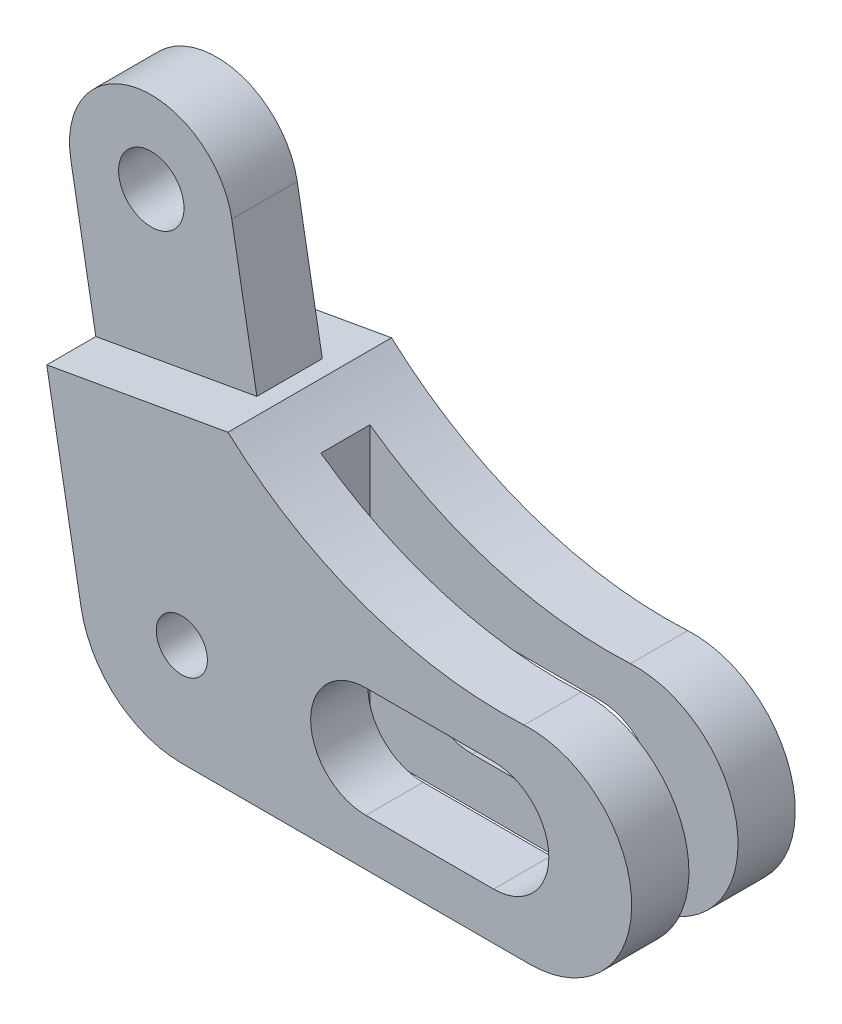
ISO-10303-21;
HEADER;
FILE_DESCRIPTION(('STEP AP214'),'2;1');
FILE_NAME('part.step','',(''),(''),'','','');
FILE_SCHEMA(('AUTOMOTIVE_DESIGN { 1 0 10303 214 1 1 1 1 }'));
ENDSEC;
DATA;
#1=APPLICATION_CONTEXT('core data for automotive mechanical design processes');
#2=APPLICATION_PROTOCOL_DEFINITION('international standard','automotive_design',2000,#1);
#3=PRODUCT_CONTEXT('',#1,'mechanical');
#4=PRODUCT('Part','Part','',(#3));
#5=PRODUCT_RELATED_PRODUCT_CATEGORY('part','',(#4));
#6=PRODUCT_DEFINITION_FORMATION('','',#4);
#7=PRODUCT_DEFINITION_CONTEXT('part definition',#1,'design');
#8=PRODUCT_DEFINITION('design','',#6,#7);
#9=PRODUCT_DEFINITION_SHAPE('','',#8);
#10=(LENGTH_UNIT() NAMED_UNIT(*) SI_UNIT(.MILLI.,.METRE.));
#11=(NAMED_UNIT(*) PLANE_ANGLE_UNIT() SI_UNIT($,.RADIAN.));
#12=(NAMED_UNIT(*) SI_UNIT($,.STERADIAN.) SOLID_ANGLE_UNIT());
#13=UNCERTAINTY_MEASURE_WITH_UNIT(LENGTH_MEASURE(1.E-05),#10,'distance_accuracy_value','');
#14=(GEOMETRIC_REPRESENTATION_CONTEXT(3) GLOBAL_UNCERTAINTY_ASSIGNED_CONTEXT((#13)) GLOBAL_UNIT_ASSIGNED_CONTEXT((#10,
#11,#12)) REPRESENTATION_CONTEXT('',''));
#15=CARTESIAN_POINT('',(0.,0.,0.));
#16=DIRECTION('',(0.,0.,1.));
#17=DIRECTION('',(1.,0.,0.));
#18=AXIS2_PLACEMENT_3D('',#15,#16,#17);
#19=CARTESIAN_POINT('',(85.,-13.9791294879183,20.));
#20=DIRECTION('',(0.,0.,-1.));
#21=DIRECTION('',(-1.,0.,0.));
#22=AXIS2_PLACEMENT_3D('',#19,#20,#21);
#23=CYLINDRICAL_SURFACE('',#22,25.);
#24=CARTESIAN_POINT('',(85.,-13.9791294879183,-6.));
#25=DIRECTION('',(0.,0.,1.));
#26=DIRECTION('',(1.,0.,0.));
#27=AXIS2_PLACEMENT_3D('',#24,#25,#26);
#28=CIRCLE('',#27,25.);
#29=CARTESIAN_POINT('',(85.,-38.9791294879183,-6.));
#30=VERTEX_POINT('',#29);
#31=CARTESIAN_POINT('',(83.6935094567061,10.9867088208645,-6.));
#32=VERTEX_POINT('',#31);
#33=EDGE_CURVE('E234',#30,#32,#28,.T.);
#34=ORIENTED_EDGE('',*,*,#33,.F.);
#35=DIRECTION('',(0.,0.,-1.));
#36=VECTOR('',#35,1.);
#37=CARTESIAN_POINT('',(85.,-38.9791294879183,20.));
#38=LINE('',#37,#36);
#39=CARTESIAN_POINT('',(85.,-38.9791294879183,-20.));
#40=VERTEX_POINT('',#39);
#41=EDGE_CURVE('E352',#30,#40,#38,.T.);
#42=ORIENTED_EDGE('',*,*,#41,.T.);
#43=CARTESIAN_POINT('',(85.,-13.9791294879183,-20.));
#44=DIRECTION('',(0.,0.,1.));
#45=DIRECTION('',(1.,0.,0.));
#46=AXIS2_PLACEMENT_3D('',#43,#44,#45);
#47=CIRCLE('',#46,25.);
#48=CARTESIAN_POINT('',(83.6935094567062,10.9867088208645,-20.));
#49=VERTEX_POINT('',#48);
#50=EDGE_CURVE('E334',#40,#49,#47,.T.);
#51=ORIENTED_EDGE('',*,*,#50,.T.);
#52=DIRECTION('',(0.,0.,-1.));
#53=VECTOR('',#52,1.);
#54=CARTESIAN_POINT('',(83.6935094567062,10.9867088208645,20.));
#55=LINE('',#54,#53);
#56=EDGE_CURVE('E354',#32,#49,#55,.T.);
#57=ORIENTED_EDGE('',*,*,#56,.F.);
#58=EDGE_LOOP('',(#34,#42,#51,#57));
#59=FACE_BOUND('',#58,.T.);
#60=ADVANCED_FACE('F41',(#59),#23,.T.);
#61=CARTESIAN_POINT('',(78.4675472835311,110.850062055995,20.));
#62=DIRECTION('',(0.,0.,-1.));
#63=DIRECTION('',(-1.,0.,0.));
#64=AXIS2_PLACEMENT_3D('',#61,#62,#63);
#65=CYLINDRICAL_SURFACE('',#64,100.);
#66=CARTESIAN_POINT('',(78.4675472835311,110.850062055995,6.));
#67=DIRECTION('',(0.,0.,1.));
#68=DIRECTION('',(1.,0.,0.));
#69=AXIS2_PLACEMENT_3D('',#66,#67,#68);
#70=CIRCLE('',#69,100.);
#71=CARTESIAN_POINT('',(20.,29.723334557297,6.));
#72=VERTEX_POINT('',#71);
#73=CARTESIAN_POINT('',(83.6935094567061,10.9867088208645,6.));
#74=VERTEX_POINT('',#73);
#75=EDGE_CURVE('E231',#72,#74,#70,.T.);
#76=ORIENTED_EDGE('',*,*,#75,.F.);
#77=DIRECTION('',(0.,0.,1.));
#78=VECTOR('',#77,1.);
#79=CARTESIAN_POINT('',(20.,29.723334557297,-6.));
#80=LINE('',#79,#78);
#81=CARTESIAN_POINT('',(20.,29.723334557297,-6.));
#82=VERTEX_POINT('',#81);
#83=EDGE_CURVE('E249',#82,#72,#80,.T.);
#84=ORIENTED_EDGE('',*,*,#83,.F.);
#85=CARTESIAN_POINT('',(78.4675472835311,110.850062055995,-6.));
#86=DIRECTION('',(0.,0.,1.));
#87=DIRECTION('',(1.,0.,0.));
#88=AXIS2_PLACEMENT_3D('',#85,#86,#87);
#89=CIRCLE('',#88,100.);
#90=EDGE_CURVE('E240',#82,#32,#89,.T.);
#91=ORIENTED_EDGE('',*,*,#90,.T.);
#92=ORIENTED_EDGE('',*,*,#56,.T.);
#93=CARTESIAN_POINT('',(78.4675472835311,110.850062055995,-20.));
#94=DIRECTION('',(0.,0.,-1.));
#95=DIRECTION('',(-1.,0.,0.));
#96=AXIS2_PLACEMENT_3D('',#93,#94,#95);
#97=CIRCLE('',#96,100.);
#98=CARTESIAN_POINT('',(11.2814110906631,36.7823693453851,-20.));
#99=VERTEX_POINT('',#98);
#100=EDGE_CURVE('E339',#49,#99,#97,.T.);
#101=ORIENTED_EDGE('',*,*,#100,.T.);
#102=DIRECTION('',(0.,0.,-1.));
#103=VECTOR('',#102,1.);
#104=CARTESIAN_POINT('',(11.2814110906631,36.7823693453851,20.));
#105=LINE('',#104,#103);
#106=CARTESIAN_POINT('',(11.2814110906631,36.7823693453851,20.));
#107=VERTEX_POINT('',#106);
#108=EDGE_CURVE('E346',#107,#99,#105,.T.);
#109=ORIENTED_EDGE('',*,*,#108,.F.);
#110=CARTESIAN_POINT('',(78.4675472835311,110.850062055995,20.));
#111=DIRECTION('',(0.,0.,-1.));
#112=DIRECTION('',(-1.,0.,0.));
#113=AXIS2_PLACEMENT_3D('',#110,#111,#112);
#114=CIRCLE('',#113,100.);
#115=CARTESIAN_POINT('',(83.6935094567062,10.9867088208645,20.));
#116=VERTEX_POINT('',#115);
#117=EDGE_CURVE('E321',#116,#107,#114,.T.);
#118=ORIENTED_EDGE('',*,*,#117,.F.);
#119=EDGE_CURVE('E351',#116,#74,#55,.T.);
#120=ORIENTED_EDGE('',*,*,#119,.T.);
#121=EDGE_LOOP('',(#76,#84,#91,#92,#101,#109,#118,#120));
#122=FACE_BOUND('',#121,.T.);
#123=ADVANCED_FACE('F399',(#122),#65,.F.);
#124=CARTESIAN_POINT('',(45.,-13.9791294879183,20.));
#125=DIRECTION('',(0.,0.,-1.));
#126=DIRECTION('',(-1.,0.,0.));
#127=AXIS2_PLACEMENT_3D('',#124,#125,#126);
#128=CYLINDRICAL_SURFACE('',#127,13.5);
#129=DIRECTION('',(0.,0.,-1.));
#130=VECTOR('',#129,1.);
#131=CARTESIAN_POINT('',(45.,-0.47912948791827,20.));
#132=LINE('',#131,#130);
#133=CARTESIAN_POINT('',(45.,-0.47912948791827,-6.));
#134=VERTEX_POINT('',#133);
#135=CARTESIAN_POINT('',(45.,-0.47912948791827,-20.));
#136=VERTEX_POINT('',#135);
#137=EDGE_CURVE('E278',#134,#136,#132,.T.);
#138=ORIENTED_EDGE('',*,*,#137,.F.);
#139=CARTESIAN_POINT('',(45.,-13.9791294879183,-6.));
#140=DIRECTION('',(0.,0.,1.));
#141=DIRECTION('',(1.,0.,0.));
#142=AXIS2_PLACEMENT_3D('',#139,#140,#141);
#143=CIRCLE('',#142,13.5);
#144=CARTESIAN_POINT('',(45.,-27.4791294879183,-6.));
#145=VERTEX_POINT('',#144);
#146=EDGE_CURVE('E266',#134,#145,#143,.T.);
#147=ORIENTED_EDGE('',*,*,#146,.T.);
#148=DIRECTION('',(0.,0.,-1.));
#149=VECTOR('',#148,1.);
#150=CARTESIAN_POINT('',(45.,-27.4791294879183,20.));
#151=LINE('',#150,#149);
#152=CARTESIAN_POINT('',(45.,-27.4791294879183,-20.));
#153=VERTEX_POINT('',#152);
#154=EDGE_CURVE('E305',#145,#153,#151,.T.);
#155=ORIENTED_EDGE('',*,*,#154,.T.);
#156=CARTESIAN_POINT('',(45.,-13.9791294879183,-20.));
#157=DIRECTION('',(0.,0.,1.));
#158=DIRECTION('',(1.,0.,0.));
#159=AXIS2_PLACEMENT_3D('',#156,#157,#158);
#160=CIRCLE('',#159,13.5);
#161=EDGE_CURVE('E267',#136,#153,#160,.T.);
#162=ORIENTED_EDGE('',*,*,#161,.F.);
#163=EDGE_LOOP('',(#138,#147,#155,#162));
#164=FACE_BOUND('',#163,.T.);
#165=ADVANCED_FACE('F410',(#164),#128,.F.);
#166=CARTESIAN_POINT('',(45.,-27.4791294879183,20.));
#167=DIRECTION('',(0.,1.,0.));
#168=DIRECTION('',(0.,0.,1.));
#169=AXIS2_PLACEMENT_3D('',#166,#167,#168);
#170=PLANE('',#169);
#171=ORIENTED_EDGE('',*,*,#154,.F.);
#172=DIRECTION('',(1.,0.,0.));
#173=VECTOR('',#172,1.);
#174=CARTESIAN_POINT('',(45.,-27.4791294879183,-6.));
#175=LINE('',#174,#173);
#176=CARTESIAN_POINT('',(76.2391173977927,-27.4791294879183,-6.));
#177=VERTEX_POINT('',#176);
#178=EDGE_CURVE('E263',#145,#177,#175,.T.);
#179=ORIENTED_EDGE('',*,*,#178,.T.);
#180=DIRECTION('',(0.,0.,-1.));
#181=VECTOR('',#180,1.);
#182=CARTESIAN_POINT('',(76.2391173977927,-27.4791294879183,20.));
#183=LINE('',#182,#181);
#184=CARTESIAN_POINT('',(76.2391173977927,-27.4791294879183,-20.));
#185=VERTEX_POINT('',#184);
#186=EDGE_CURVE('E300',#177,#185,#183,.T.);
#187=ORIENTED_EDGE('',*,*,#186,.T.);
#188=DIRECTION('',(1.,0.,0.));
#189=VECTOR('',#188,1.);
#190=CARTESIAN_POINT('',(45.,-27.4791294879183,-20.));
#191=LINE('',#190,#189);
#192=EDGE_CURVE('E285',#153,#185,#191,.T.);
#193=ORIENTED_EDGE('',*,*,#192,.F.);
#194=EDGE_LOOP('',(#171,#179,#187,#193));
#195=FACE_BOUND('',#194,.T.);
#196=ADVANCED_FACE('F398',(#195),#170,.T.);
#197=CARTESIAN_POINT('',(76.2391173977927,-13.9791294879183,20.));
#198=DIRECTION('',(0.,0.,-1.));
#199=DIRECTION('',(-1.,0.,0.));
#200=AXIS2_PLACEMENT_3D('',#197,#198,#199);
#201=CYLINDRICAL_SURFACE('',#200,13.5);
#202=ORIENTED_EDGE('',*,*,#186,.F.);
#203=CARTESIAN_POINT('',(76.2391173977927,-13.9791294879183,-6.));
#204=DIRECTION('',(0.,0.,1.));
#205=DIRECTION('',(1.,0.,0.));
#206=AXIS2_PLACEMENT_3D('',#203,#204,#205);
#207=CIRCLE('',#206,13.5);
#208=CARTESIAN_POINT('',(76.2391173977927,-0.47912948791827,-6.));
#209=VERTEX_POINT('',#208);
#210=EDGE_CURVE('E257',#177,#209,#207,.T.);
#211=ORIENTED_EDGE('',*,*,#210,.T.);
#212=DIRECTION('',(0.,0.,-1.));
#213=VECTOR('',#212,1.);
#214=CARTESIAN_POINT('',(76.2391173977927,-0.47912948791827,20.));
#215=LINE('',#214,#213);
#216=CARTESIAN_POINT('',(76.2391173977927,-0.47912948791827,-20.));
#217=VERTEX_POINT('',#216);
#218=EDGE_CURVE('E294',#209,#217,#215,.T.);
#219=ORIENTED_EDGE('',*,*,#218,.T.);
#220=CARTESIAN_POINT('',(76.2391173977927,-13.9791294879183,-20.));
#221=DIRECTION('',(0.,0.,1.));
#222=DIRECTION('',(1.,0.,0.));
#223=AXIS2_PLACEMENT_3D('',#220,#221,#222);
#224=CIRCLE('',#223,13.5);
#225=EDGE_CURVE('E288',#185,#217,#224,.T.);
#226=ORIENTED_EDGE('',*,*,#225,.F.);
#227=EDGE_LOOP('',(#202,#211,#219,#226));
#228=FACE_BOUND('',#227,.T.);
#229=ADVANCED_FACE('F390',(#228),#201,.F.);
#230=CARTESIAN_POINT('',(45.,-0.47912948791827,20.));
#231=DIRECTION('',(0.,-1.,0.));
#232=DIRECTION('',(0.,0.,-1.));
#233=AXIS2_PLACEMENT_3D('',#230,#231,#232);
#234=PLANE('',#233);
#235=ORIENTED_EDGE('',*,*,#218,.F.);
#236=DIRECTION('',(-1.,0.,0.));
#237=VECTOR('',#236,1.);
#238=CARTESIAN_POINT('',(45.,-0.47912948791827,-6.));
#239=LINE('',#238,#237);
#240=EDGE_CURVE('E11',#209,#134,#239,.T.);
#241=ORIENTED_EDGE('',*,*,#240,.T.);
#242=ORIENTED_EDGE('',*,*,#137,.T.);
#243=DIRECTION('',(-1.,0.,0.));
#244=VECTOR('',#243,1.);
#245=CARTESIAN_POINT('',(45.,-0.47912948791827,-20.));
#246=LINE('',#245,#244);
#247=EDGE_CURVE('E272',#217,#136,#246,.T.);
#248=ORIENTED_EDGE('',*,*,#247,.F.);
#249=EDGE_LOOP('',(#235,#241,#242,#248));
#250=FACE_BOUND('',#249,.T.);
#251=ADVANCED_FACE('F393',(#250),#234,.T.);
#252=CARTESIAN_POINT('',(0.,-13.9791294879183,20.));
#253=DIRECTION('',(0.,0.,1.));
#254=DIRECTION('',(1.,0.,0.));
#255=AXIS2_PLACEMENT_3D('',#252,#253,#254);
#256=PLANE('',#255);
#257=CARTESIAN_POINT('',(0.,-13.9791294879183,20.));
#258=DIRECTION('',(0.,0.,1.));
#259=DIRECTION('',(1.,0.,0.));
#260=AXIS2_PLACEMENT_3D('',#257,#258,#259);
#261=CIRCLE('',#260,25.);
#262=CARTESIAN_POINT('',(-24.6133521247395,-18.3589579301727,20.));
#263=VERTEX_POINT('',#262);
#264=CARTESIAN_POINT('',(0.,-38.9791294879183,20.));
#265=VERTEX_POINT('',#264);
#266=EDGE_CURVE('E311',#263,#265,#261,.T.);
#267=ORIENTED_EDGE('',*,*,#266,.T.);
#268=DIRECTION('',(1.,0.,0.));
#269=VECTOR('',#268,1.);
#270=CARTESIAN_POINT('',(0.,-38.9791294879183,20.));
#271=LINE('',#270,#269);
#272=CARTESIAN_POINT('',(85.,-38.9791294879183,20.));
#273=VERTEX_POINT('',#272);
#274=EDGE_CURVE('E316',#265,#273,#271,.T.);
#275=ORIENTED_EDGE('',*,*,#274,.T.);
#276=CARTESIAN_POINT('',(85.,-13.9791294879183,20.));
#277=DIRECTION('',(0.,0.,1.));
#278=DIRECTION('',(1.,0.,0.));
#279=AXIS2_PLACEMENT_3D('',#276,#277,#278);
#280=CIRCLE('',#279,25.);
#281=EDGE_CURVE('E317',#273,#116,#280,.T.);
#282=ORIENTED_EDGE('',*,*,#281,.T.);
#283=ORIENTED_EDGE('',*,*,#117,.T.);
#284=DIRECTION('',(-0.98453408498958,-0.175193137690178,0.));
#285=VECTOR('',#284,1.);
#286=CARTESIAN_POINT('',(11.281411090663,36.7823693453851,20.));
#287=LINE('',#286,#285);
#288=CARTESIAN_POINT('',(-33.0226227338681,28.8986781493271,20.));
#289=VERTEX_POINT('',#288);
#290=EDGE_CURVE('E323',#107,#289,#287,.T.);
#291=ORIENTED_EDGE('',*,*,#290,.T.);
#292=DIRECTION('',(0.175193137690178,-0.98453408498958,0.));
#293=VECTOR('',#292,1.);
#294=CARTESIAN_POINT('',(-33.0226227338681,28.8986781493271,20.));
#295=LINE('',#294,#293);
#296=EDGE_CURVE('E324',#289,#263,#295,.T.);
#297=ORIENTED_EDGE('',*,*,#296,.T.);
#298=EDGE_LOOP('',(#267,#275,#282,#283,#291,#297));
#299=FACE_BOUND('',#298,.T.);
#300=CARTESIAN_POINT('',(0.,-13.9791294879183,20.));
#301=DIRECTION('',(0.,0.,1.));
#302=DIRECTION('',(1.,0.,0.));
#303=AXIS2_PLACEMENT_3D('',#300,#301,#302);
#304=CIRCLE('',#303,6.25);
#305=CARTESIAN_POINT('',(6.25,-13.9791294879183,20.));
#306=VERTEX_POINT('',#305);
#307=EDGE_CURVE('E307',#306,#306,#304,.T.);
#308=ORIENTED_EDGE('',*,*,#307,.F.);
#309=EDGE_LOOP('',(#308));
#310=FACE_BOUND('',#309,.T.);
#311=DIRECTION('',(1.,0.,0.));
#312=VECTOR('',#311,1.);
#313=CARTESIAN_POINT('',(45.,-27.4791294879183,20.));
#314=LINE('',#313,#312);
#315=CARTESIAN_POINT('',(45.,-27.4791294879183,20.));
#316=VERTEX_POINT('',#315);
#317=CARTESIAN_POINT('',(76.2391173977927,-27.4791294879183,20.));
#318=VERTEX_POINT('',#317);
#319=EDGE_CURVE('E275',#316,#318,#314,.T.);
#320=ORIENTED_EDGE('',*,*,#319,.F.);
#321=CARTESIAN_POINT('',(45.,-13.9791294879183,20.));
#322=DIRECTION('',(0.,0.,1.));
#323=DIRECTION('',(1.,0.,0.));
#324=AXIS2_PLACEMENT_3D('',#321,#322,#323);
#325=CIRCLE('',#324,13.5);
#326=CARTESIAN_POINT('',(45.,-0.47912948791827,20.));
#327=VERTEX_POINT('',#326);
#328=EDGE_CURVE('E269',#327,#316,#325,.T.);
#329=ORIENTED_EDGE('',*,*,#328,.F.);
#330=DIRECTION('',(-1.,0.,0.));
#331=VECTOR('',#330,1.);
#332=CARTESIAN_POINT('',(45.,-0.47912948791827,20.));
#333=LINE('',#332,#331);
#334=CARTESIAN_POINT('',(76.2391173977927,-0.47912948791827,20.));
#335=VERTEX_POINT('',#334);
#336=EDGE_CURVE('E279',#335,#327,#333,.T.);
#337=ORIENTED_EDGE('',*,*,#336,.F.);
#338=CARTESIAN_POINT('',(76.2391173977927,-13.9791294879183,20.));
#339=DIRECTION('',(0.,0.,1.));
#340=DIRECTION('',(1.,0.,0.));
#341=AXIS2_PLACEMENT_3D('',#338,#339,#340);
#342=CIRCLE('',#341,13.5);
#343=EDGE_CURVE('E274',#318,#335,#342,.T.);
#344=ORIENTED_EDGE('',*,*,#343,.F.);
#345=EDGE_LOOP('',(#320,#329,#337,#344));
#346=FACE_BOUND('',#345,.T.);
#347=ADVANCED_FACE('F377',(#299,#310,#346),#256,.T.);
#348=CARTESIAN_POINT('',(0.,-13.9791294879183,-20.));
#349=DIRECTION('',(0.,0.,1.));
#350=DIRECTION('',(1.,0.,0.));
#351=AXIS2_PLACEMENT_3D('',#348,#349,#350);
#352=PLANE('',#351);
#353=CARTESIAN_POINT('',(0.,-13.9791294879183,-20.));
#354=DIRECTION('',(0.,0.,1.));
#355=DIRECTION('',(1.,0.,0.));
#356=AXIS2_PLACEMENT_3D('',#353,#354,#355);
#357=CIRCLE('',#356,6.25);
#358=CARTESIAN_POINT('',(6.25,-13.9791294879183,-20.));
#359=VERTEX_POINT('',#358);
#360=EDGE_CURVE('E308',#359,#359,#357,.T.);
#361=ORIENTED_EDGE('',*,*,#360,.T.);
#362=EDGE_LOOP('',(#361));
#363=FACE_BOUND('',#362,.T.);
#364=CARTESIAN_POINT('',(0.,-13.9791294879183,-20.));
#365=DIRECTION('',(0.,0.,1.));
#366=DIRECTION('',(1.,0.,0.));
#367=AXIS2_PLACEMENT_3D('',#364,#365,#366);
#368=CIRCLE('',#367,25.);
#369=CARTESIAN_POINT('',(-24.6133521247395,-18.3589579301727,-20.));
#370=VERTEX_POINT('',#369);
#371=CARTESIAN_POINT('',(0.,-38.9791294879183,-20.));
#372=VERTEX_POINT('',#371);
#373=EDGE_CURVE('E309',#370,#372,#368,.T.);
#374=ORIENTED_EDGE('',*,*,#373,.F.);
#375=DIRECTION('',(0.175193137690178,-0.98453408498958,0.));
#376=VECTOR('',#375,1.);
#377=CARTESIAN_POINT('',(-33.0226227338681,28.8986781493271,-20.));
#378=LINE('',#377,#376);
#379=CARTESIAN_POINT('',(-33.0226227338681,28.8986781493271,-20.));
#380=VERTEX_POINT('',#379);
#381=EDGE_CURVE('E320',#380,#370,#378,.T.);
#382=ORIENTED_EDGE('',*,*,#381,.F.);
#383=DIRECTION('',(-0.98453408498958,-0.175193137690178,0.));
#384=VECTOR('',#383,1.);
#385=CARTESIAN_POINT('',(11.281411090663,36.7823693453851,-20.));
#386=LINE('',#385,#384);
#387=EDGE_CURVE('E340',#99,#380,#386,.T.);
#388=ORIENTED_EDGE('',*,*,#387,.F.);
#389=ORIENTED_EDGE('',*,*,#100,.F.);
#390=ORIENTED_EDGE('',*,*,#50,.F.);
#391=DIRECTION('',(1.,0.,0.));
#392=VECTOR('',#391,1.);
#393=CARTESIAN_POINT('',(0.,-38.9791294879183,-20.));
#394=LINE('',#393,#392);
#395=EDGE_CURVE('E329',#372,#40,#394,.T.);
#396=ORIENTED_EDGE('',*,*,#395,.F.);
#397=EDGE_LOOP('',(#374,#382,#388,#389,#390,#396));
#398=FACE_BOUND('',#397,.T.);
#399=ORIENTED_EDGE('',*,*,#161,.T.);
#400=ORIENTED_EDGE('',*,*,#192,.T.);
#401=ORIENTED_EDGE('',*,*,#225,.T.);
#402=ORIENTED_EDGE('',*,*,#247,.T.);
#403=EDGE_LOOP('',(#399,#400,#401,#402));
#404=FACE_BOUND('',#403,.T.);
#405=ADVANCED_FACE('F447',(#363,#398,#404),#352,.F.);
#406=CARTESIAN_POINT('',(0.,-13.9791294879183,20.));
#407=DIRECTION('',(0.,0.,-1.));
#408=DIRECTION('',(-1.,0.,0.));
#409=AXIS2_PLACEMENT_3D('',#406,#407,#408);
#410=CYLINDRICAL_SURFACE('',#409,25.);
#411=ORIENTED_EDGE('',*,*,#373,.T.);
#412=DIRECTION('',(0.,0.,-1.));
#413=VECTOR('',#412,1.);
#414=CARTESIAN_POINT('',(0.,-38.9791294879183,20.));
#415=LINE('',#414,#413);
#416=EDGE_CURVE('E357',#265,#372,#415,.T.);
#417=ORIENTED_EDGE('',*,*,#416,.F.);
#418=ORIENTED_EDGE('',*,*,#266,.F.);
#419=DIRECTION('',(0.,0.,-1.));
#420=VECTOR('',#419,1.);
#421=CARTESIAN_POINT('',(-24.6133521247395,-18.3589579301727,20.));
#422=LINE('',#421,#420);
#423=EDGE_CURVE('E330',#263,#370,#422,.T.);
#424=ORIENTED_EDGE('',*,*,#423,.T.);
#425=EDGE_LOOP('',(#411,#417,#418,#424));
#426=FACE_BOUND('',#425,.T.);
#427=ADVANCED_FACE('F43',(#426),#410,.T.);
#428=CARTESIAN_POINT('',(0.,-38.9791294879183,20.));
#429=DIRECTION('',(0.,1.,0.));
#430=DIRECTION('',(-1.,0.,0.));
#431=AXIS2_PLACEMENT_3D('',#428,#429,#430);
#432=PLANE('',#431);
#433=DIRECTION('',(0.,0.,1.));
#434=VECTOR('',#433,1.);
#435=CARTESIAN_POINT('',(20.,-38.9791294879183,-6.));
#436=LINE('',#435,#434);
#437=CARTESIAN_POINT('',(20.,-38.9791294879183,-6.));
#438=VERTEX_POINT('',#437);
#439=CARTESIAN_POINT('',(20.,-38.9791294879183,6.));
#440=VERTEX_POINT('',#439);
#441=EDGE_CURVE('E238',#438,#440,#436,.T.);
#442=ORIENTED_EDGE('',*,*,#441,.T.);
#443=DIRECTION('',(1.,0.,0.));
#444=VECTOR('',#443,1.);
#445=CARTESIAN_POINT('',(20.,-38.9791294879183,6.));
#446=LINE('',#445,#444);
#447=CARTESIAN_POINT('',(85.,-38.9791294879183,6.));
#448=VERTEX_POINT('',#447);
#449=EDGE_CURVE('E245',#440,#448,#446,.T.);
#450=ORIENTED_EDGE('',*,*,#449,.T.);
#451=EDGE_CURVE('E358',#273,#448,#38,.T.);
#452=ORIENTED_EDGE('',*,*,#451,.F.);
#453=ORIENTED_EDGE('',*,*,#274,.F.);
#454=ORIENTED_EDGE('',*,*,#416,.T.);
#455=ORIENTED_EDGE('',*,*,#395,.T.);
#456=ORIENTED_EDGE('',*,*,#41,.F.);
#457=DIRECTION('',(1.,0.,0.));
#458=VECTOR('',#457,1.);
#459=CARTESIAN_POINT('',(20.,-38.9791294879183,-6.));
#460=LINE('',#459,#458);
#461=EDGE_CURVE('E235',#438,#30,#460,.T.);
#462=ORIENTED_EDGE('',*,*,#461,.F.);
#463=EDGE_LOOP('',(#442,#450,#452,#453,#454,#455,#456,#462));
#464=FACE_BOUND('',#463,.T.);
#465=ADVANCED_FACE('F412',(#464),#432,.F.);
#466=ORIENTED_EDGE('',*,*,#451,.T.);
#467=CARTESIAN_POINT('',(85.,-13.9791294879183,6.));
#468=DIRECTION('',(0.,0.,1.));
#469=DIRECTION('',(1.,0.,0.));
#470=AXIS2_PLACEMENT_3D('',#467,#468,#469);
#471=CIRCLE('',#470,25.);
#472=EDGE_CURVE('E248',#448,#74,#471,.T.);
#473=ORIENTED_EDGE('',*,*,#472,.T.);
#474=ORIENTED_EDGE('',*,*,#119,.F.);
#475=ORIENTED_EDGE('',*,*,#281,.F.);
#476=EDGE_LOOP('',(#466,#473,#474,#475));
#477=FACE_BOUND('',#476,.T.);
#478=ADVANCED_FACE('F401',(#477),#23,.T.);
#479=CARTESIAN_POINT('',(11.281411090663,36.7823693453851,20.));
#480=DIRECTION('',(0.175193137690178,-0.98453408498958,0.));
#481=DIRECTION('',(0.98453408498958,0.175193137690178,0.));
#482=AXIS2_PLACEMENT_3D('',#479,#480,#481);
#483=PLANE('',#482);
#484=DIRECTION('',(0.,0.,1.));
#485=VECTOR('',#484,1.);
#486=CARTESIAN_POINT('',(6.35874066571517,35.9064036569342,-8.));
#487=LINE('',#486,#485);
#488=CARTESIAN_POINT('',(6.35874066571517,35.9064036569342,-8.));
#489=VERTEX_POINT('',#488);
#490=CARTESIAN_POINT('',(6.35874066571517,35.9064036569342,8.));
#491=VERTEX_POINT('',#490);
#492=EDGE_CURVE('E57',#489,#491,#487,.T.);
#493=ORIENTED_EDGE('',*,*,#492,.T.);
#494=DIRECTION('',(-0.984534084989581,-0.175193137690178,0.));
#495=VECTOR('',#494,1.);
#496=CARTESIAN_POINT('',(-5.99809981333845,33.7075629174739,8.));
#497=LINE('',#496,#495);
#498=CARTESIAN_POINT('',(-33.0226227338681,28.8986781493271,8.));
#499=VERTEX_POINT('',#498);
#500=EDGE_CURVE('E209',#491,#499,#497,.T.);
#501=ORIENTED_EDGE('',*,*,#500,.T.);
#502=DIRECTION('',(0.,0.,-1.));
#503=VECTOR('',#502,1.);
#504=CARTESIAN_POINT('',(-33.0226227338681,28.8986781493271,20.));
#505=LINE('',#504,#503);
#506=EDGE_CURVE('E344',#289,#499,#505,.T.);
#507=ORIENTED_EDGE('',*,*,#506,.F.);
#508=ORIENTED_EDGE('',*,*,#290,.F.);
#509=ORIENTED_EDGE('',*,*,#108,.T.);
#510=ORIENTED_EDGE('',*,*,#387,.T.);
#511=CARTESIAN_POINT('',(-33.0226227338681,28.8986781493271,-8.));
#512=VERTEX_POINT('',#511);
#513=EDGE_CURVE('E342',#512,#380,#505,.T.);
#514=ORIENTED_EDGE('',*,*,#513,.F.);
#515=DIRECTION('',(-0.984534084989581,-0.175193137690178,0.));
#516=VECTOR('',#515,1.);
#517=CARTESIAN_POINT('',(-5.99809981333845,33.7075629174739,-8.));
#518=LINE('',#517,#516);
#519=EDGE_CURVE('E64',#489,#512,#518,.T.);
#520=ORIENTED_EDGE('',*,*,#519,.F.);
#521=EDGE_LOOP('',(#493,#501,#507,#508,#509,#510,#514,#520));
#522=FACE_BOUND('',#521,.T.);
#523=ADVANCED_FACE('F411',(#522),#483,.F.);
#524=CARTESIAN_POINT('',(-33.0226227338681,28.8986781493271,20.));
#525=DIRECTION('',(0.98453408498958,0.175193137690178,0.));
#526=DIRECTION('',(-0.175193137690178,0.98453408498958,0.));
#527=AXIS2_PLACEMENT_3D('',#524,#525,#526);
#528=PLANE('',#527);
#529=ORIENTED_EDGE('',*,*,#381,.T.);
#530=ORIENTED_EDGE('',*,*,#423,.F.);
#531=ORIENTED_EDGE('',*,*,#296,.F.);
#532=ORIENTED_EDGE('',*,*,#506,.T.);
#533=DIRECTION('',(-0.175193137690178,0.984534084989581,0.));
#534=VECTOR('',#533,1.);
#535=CARTESIAN_POINT('',(-27.0245229205296,-4.80888476814678,8.));
#536=LINE('',#535,#534);
#537=CARTESIAN_POINT('',(-39.1543825530243,63.3573711239624,8.));
#538=VERTEX_POINT('',#537);
#539=EDGE_CURVE('E210',#499,#538,#536,.T.);
#540=ORIENTED_EDGE('',*,*,#539,.T.);
#541=DIRECTION('',(0.,0.,1.));
#542=VECTOR('',#541,1.);
#543=CARTESIAN_POINT('',(-39.1543825530243,63.3573711239624,-8.));
#544=LINE('',#543,#542);
#545=CARTESIAN_POINT('',(-39.1543825530243,63.3573711239624,-8.));
#546=VERTEX_POINT('',#545);
#547=EDGE_CURVE('E196',#546,#538,#544,.T.);
#548=ORIENTED_EDGE('',*,*,#547,.F.);
#549=DIRECTION('',(-0.175193137690178,0.984534084989581,0.));
#550=VECTOR('',#549,1.);
#551=CARTESIAN_POINT('',(-27.0245229205296,-4.80888476814678,-8.));
#552=LINE('',#551,#550);
#553=EDGE_CURVE('E224',#512,#546,#552,.T.);
#554=ORIENTED_EDGE('',*,*,#553,.F.);
#555=ORIENTED_EDGE('',*,*,#513,.T.);
#556=EDGE_LOOP('',(#529,#530,#531,#532,#540,#548,#554,#555));
#557=FACE_BOUND('',#556,.T.);
#558=ADVANCED_FACE('F423',(#557),#528,.F.);
#559=CARTESIAN_POINT('',(0.,-13.9791294879183,20.));
#560=DIRECTION('',(0.,0.,-1.));
#561=DIRECTION('',(-1.,0.,0.));
#562=AXIS2_PLACEMENT_3D('',#559,#560,#561);
#563=CYLINDRICAL_SURFACE('',#562,6.25);
#564=ORIENTED_EDGE('',*,*,#307,.T.);
#565=EDGE_LOOP('',(#564));
#566=FACE_BOUND('',#565,.T.);
#567=ORIENTED_EDGE('',*,*,#360,.F.);
#568=EDGE_LOOP('',(#567));
#569=FACE_BOUND('',#568,.T.);
#570=ADVANCED_FACE('F489',(#566,#569),#563,.F.);
#571=CARTESIAN_POINT('',(45.,-13.9791294879183,6.));
#572=DIRECTION('',(0.,0.,1.));
#573=DIRECTION('',(1.,0.,0.));
#574=AXIS2_PLACEMENT_3D('',#571,#572,#573);
#575=CIRCLE('',#574,13.5);
#576=CARTESIAN_POINT('',(45.,-0.47912948791827,6.));
#577=VERTEX_POINT('',#576);
#578=CARTESIAN_POINT('',(45.,-27.4791294879183,6.));
#579=VERTEX_POINT('',#578);
#580=EDGE_CURVE('E256',#577,#579,#575,.T.);
#581=ORIENTED_EDGE('',*,*,#580,.F.);
#582=EDGE_CURVE('E292',#327,#577,#132,.T.);
#583=ORIENTED_EDGE('',*,*,#582,.F.);
#584=ORIENTED_EDGE('',*,*,#328,.T.);
#585=EDGE_CURVE('E301',#316,#579,#151,.T.);
#586=ORIENTED_EDGE('',*,*,#585,.T.);
#587=EDGE_LOOP('',(#581,#583,#584,#586));
#588=FACE_BOUND('',#587,.T.);
#589=ADVANCED_FACE('F371',(#588),#128,.F.);
#590=DIRECTION('',(1.,0.,0.));
#591=VECTOR('',#590,1.);
#592=CARTESIAN_POINT('',(45.,-27.4791294879183,6.));
#593=LINE('',#592,#591);
#594=CARTESIAN_POINT('',(76.2391173977927,-27.4791294879183,6.));
#595=VERTEX_POINT('',#594);
#596=EDGE_CURVE('E258',#579,#595,#593,.T.);
#597=ORIENTED_EDGE('',*,*,#596,.F.);
#598=ORIENTED_EDGE('',*,*,#585,.F.);
#599=ORIENTED_EDGE('',*,*,#319,.T.);
#600=EDGE_CURVE('E298',#318,#595,#183,.T.);
#601=ORIENTED_EDGE('',*,*,#600,.T.);
#602=EDGE_LOOP('',(#597,#598,#599,#601));
#603=FACE_BOUND('',#602,.T.);
#604=ADVANCED_FACE('F381',(#603),#170,.T.);
#605=CARTESIAN_POINT('',(76.2391173977927,-13.9791294879183,6.));
#606=DIRECTION('',(0.,0.,1.));
#607=DIRECTION('',(1.,0.,0.));
#608=AXIS2_PLACEMENT_3D('',#605,#606,#607);
#609=CIRCLE('',#608,13.5);
#610=CARTESIAN_POINT('',(76.2391173977927,-0.47912948791827,6.));
#611=VERTEX_POINT('',#610);
#612=EDGE_CURVE('E252',#595,#611,#609,.T.);
#613=ORIENTED_EDGE('',*,*,#612,.F.);
#614=ORIENTED_EDGE('',*,*,#600,.F.);
#615=ORIENTED_EDGE('',*,*,#343,.T.);
#616=EDGE_CURVE('E293',#335,#611,#215,.T.);
#617=ORIENTED_EDGE('',*,*,#616,.T.);
#618=EDGE_LOOP('',(#613,#614,#615,#617));
#619=FACE_BOUND('',#618,.T.);
#620=ADVANCED_FACE('F383',(#619),#201,.F.);
#621=DIRECTION('',(-1.,0.,0.));
#622=VECTOR('',#621,1.);
#623=CARTESIAN_POINT('',(45.,-0.47912948791827,6.));
#624=LINE('',#623,#622);
#625=EDGE_CURVE('E47',#611,#577,#624,.T.);
#626=ORIENTED_EDGE('',*,*,#625,.F.);
#627=ORIENTED_EDGE('',*,*,#616,.F.);
#628=ORIENTED_EDGE('',*,*,#336,.T.);
#629=ORIENTED_EDGE('',*,*,#582,.T.);
#630=EDGE_LOOP('',(#626,#627,#628,#629));
#631=FACE_BOUND('',#630,.T.);
#632=ADVANCED_FACE('F372',(#631),#234,.T.);
#633=CARTESIAN_POINT('',(20.,29.7233345572971,-6.));
#634=DIRECTION('',(-1.,0.,0.));
#635=DIRECTION('',(0.,0.,1.));
#636=AXIS2_PLACEMENT_3D('',#633,#634,#635);
#637=PLANE('',#636);
#638=DIRECTION('',(0.,-1.,0.));
#639=VECTOR('',#638,1.);
#640=CARTESIAN_POINT('',(20.,29.7233345572971,6.));
#641=LINE('',#640,#639);
#642=EDGE_CURVE('E226',#72,#440,#641,.T.);
#643=ORIENTED_EDGE('',*,*,#642,.T.);
#644=ORIENTED_EDGE('',*,*,#441,.F.);
#645=DIRECTION('',(0.,-1.,0.));
#646=VECTOR('',#645,1.);
#647=CARTESIAN_POINT('',(20.,29.7233345572971,-6.));
#648=LINE('',#647,#646);
#649=EDGE_CURVE('E228',#82,#438,#648,.T.);
#650=ORIENTED_EDGE('',*,*,#649,.F.);
#651=ORIENTED_EDGE('',*,*,#83,.T.);
#652=EDGE_LOOP('',(#643,#644,#650,#651));
#653=FACE_BOUND('',#652,.T.);
#654=ADVANCED_FACE('F391',(#653),#637,.F.);
#655=CARTESIAN_POINT('',(85.,-13.9791294879183,-6.));
#656=DIRECTION('',(0.,0.,1.));
#657=DIRECTION('',(1.,0.,0.));
#658=AXIS2_PLACEMENT_3D('',#655,#656,#657);
#659=PLANE('',#658);
#660=ORIENTED_EDGE('',*,*,#240,.F.);
#661=ORIENTED_EDGE('',*,*,#210,.F.);
#662=ORIENTED_EDGE('',*,*,#178,.F.);
#663=ORIENTED_EDGE('',*,*,#146,.F.);
#664=EDGE_LOOP('',(#660,#661,#662,#663));
#665=FACE_BOUND('',#664,.T.);
#666=ORIENTED_EDGE('',*,*,#649,.T.);
#667=ORIENTED_EDGE('',*,*,#461,.T.);
#668=ORIENTED_EDGE('',*,*,#33,.T.);
#669=ORIENTED_EDGE('',*,*,#90,.F.);
#670=EDGE_LOOP('',(#666,#667,#668,#669));
#671=FACE_BOUND('',#670,.T.);
#672=ADVANCED_FACE('F452',(#665,#671),#659,.T.);
#673=CARTESIAN_POINT('',(85.,-13.9791294879183,6.));
#674=DIRECTION('',(0.,0.,1.));
#675=DIRECTION('',(1.,0.,0.));
#676=AXIS2_PLACEMENT_3D('',#673,#674,#675);
#677=PLANE('',#676);
#678=ORIENTED_EDGE('',*,*,#580,.T.);
#679=ORIENTED_EDGE('',*,*,#596,.T.);
#680=ORIENTED_EDGE('',*,*,#612,.T.);
#681=ORIENTED_EDGE('',*,*,#625,.T.);
#682=EDGE_LOOP('',(#678,#679,#680,#681));
#683=FACE_BOUND('',#682,.T.);
#684=ORIENTED_EDGE('',*,*,#642,.F.);
#685=ORIENTED_EDGE('',*,*,#75,.T.);
#686=ORIENTED_EDGE('',*,*,#472,.F.);
#687=ORIENTED_EDGE('',*,*,#449,.F.);
#688=EDGE_LOOP('',(#684,#685,#686,#687));
#689=FACE_BOUND('',#688,.T.);
#690=ADVANCED_FACE('F365',(#683,#689),#677,.F.);
#691=CARTESIAN_POINT('',(12.3568404790536,2.19884073946036,-8.));
#692=DIRECTION('',(-0.98453408498958,-0.175193137690179,0.));
#693=DIRECTION('',(0.175193137690179,-0.984534084989581,0.));
#694=AXIS2_PLACEMENT_3D('',#691,#692,#693);
#695=PLANE('',#694);
#696=DIRECTION('',(0.,0.,1.));
#697=VECTOR('',#696,1.);
#698=CARTESIAN_POINT('',(0.226980846558925,70.3650966315696,-8.));
#699=LINE('',#698,#697);
#700=CARTESIAN_POINT('',(0.226980846558925,70.3650966315696,-8.));
#701=VERTEX_POINT('',#700);
#702=CARTESIAN_POINT('',(0.226980846558925,70.3650966315696,8.));
#703=VERTEX_POINT('',#702);
#704=EDGE_CURVE('E190',#701,#703,#699,.T.);
#705=ORIENTED_EDGE('',*,*,#704,.T.);
#706=DIRECTION('',(0.175193137690179,-0.984534084989581,0.));
#707=VECTOR('',#706,1.);
#708=CARTESIAN_POINT('',(12.3568404790536,2.19884073946036,8.));
#709=LINE('',#708,#707);
#710=EDGE_CURVE('E195',#703,#491,#709,.T.);
#711=ORIENTED_EDGE('',*,*,#710,.T.);
#712=ORIENTED_EDGE('',*,*,#492,.F.);
#713=DIRECTION('',(0.175193137690179,-0.984534084989581,0.));
#714=VECTOR('',#713,1.);
#715=CARTESIAN_POINT('',(12.3568404790536,2.19884073946036,-8.));
#716=LINE('',#715,#714);
#717=EDGE_CURVE('E192',#701,#489,#716,.T.);
#718=ORIENTED_EDGE('',*,*,#717,.F.);
#719=EDGE_LOOP('',(#705,#711,#712,#718));
#720=FACE_BOUND('',#719,.T.);
#721=ADVANCED_FACE('F187',(#720),#695,.F.);
#722=CARTESIAN_POINT('',(-19.4637008532327,66.861233877766,-8.));
#723=DIRECTION('',(0.,0.,1.));
#724=DIRECTION('',(1.,0.,0.));
#725=AXIS2_PLACEMENT_3D('',#722,#723,#724);
#726=CYLINDRICAL_SURFACE('',#725,20.);
#727=ORIENTED_EDGE('',*,*,#547,.T.);
#728=CARTESIAN_POINT('',(-19.4637008532327,66.861233877766,8.));
#729=DIRECTION('',(0.,0.,1.));
#730=DIRECTION('',(1.,0.,0.));
#731=AXIS2_PLACEMENT_3D('',#728,#729,#730);
#732=CIRCLE('',#731,20.);
#733=EDGE_CURVE('E203',#703,#538,#732,.T.);
#734=ORIENTED_EDGE('',*,*,#733,.F.);
#735=ORIENTED_EDGE('',*,*,#704,.F.);
#736=CARTESIAN_POINT('',(-19.4637008532327,66.861233877766,-8.));
#737=DIRECTION('',(0.,0.,1.));
#738=DIRECTION('',(1.,0.,0.));
#739=AXIS2_PLACEMENT_3D('',#736,#737,#738);
#740=CIRCLE('',#739,20.);
#741=EDGE_CURVE('E222',#701,#546,#740,.T.);
#742=ORIENTED_EDGE('',*,*,#741,.T.);
#743=EDGE_LOOP('',(#727,#734,#735,#742));
#744=FACE_BOUND('',#743,.T.);
#745=ADVANCED_FACE('F205',(#744),#726,.T.);
#746=CARTESIAN_POINT('',(0.,0.,-8.));
#747=DIRECTION('',(0.,0.,1.));
#748=DIRECTION('',(1.,0.,0.));
#749=AXIS2_PLACEMENT_3D('',#746,#747,#748);
#750=PLANE('',#749);
#751=CARTESIAN_POINT('',(-19.4637008532327,66.861233877766,-8.));
#752=DIRECTION('',(0.,0.,1.));
#753=DIRECTION('',(1.,0.,0.));
#754=AXIS2_PLACEMENT_3D('',#751,#752,#753);
#755=CIRCLE('',#754,8.);
#756=CARTESIAN_POINT('',(-11.4637008532327,66.861233877766,-8.));
#757=VERTEX_POINT('',#756);
#758=EDGE_CURVE('E211',#757,#757,#755,.T.);
#759=ORIENTED_EDGE('',*,*,#758,.T.);
#760=EDGE_LOOP('',(#759));
#761=FACE_BOUND('',#760,.T.);
#762=ORIENTED_EDGE('',*,*,#717,.T.);
#763=ORIENTED_EDGE('',*,*,#519,.T.);
#764=ORIENTED_EDGE('',*,*,#553,.T.);
#765=ORIENTED_EDGE('',*,*,#741,.F.);
#766=EDGE_LOOP('',(#762,#763,#764,#765));
#767=FACE_BOUND('',#766,.T.);
#768=ADVANCED_FACE('F467',(#761,#767),#750,.F.);
#769=CARTESIAN_POINT('',(0.,0.,8.));
#770=DIRECTION('',(0.,0.,1.));
#771=DIRECTION('',(1.,0.,0.));
#772=AXIS2_PLACEMENT_3D('',#769,#770,#771);
#773=PLANE('',#772);
#774=CARTESIAN_POINT('',(-19.4637008532327,66.861233877766,8.));
#775=DIRECTION('',(0.,0.,1.));
#776=DIRECTION('',(1.,0.,0.));
#777=AXIS2_PLACEMENT_3D('',#774,#775,#776);
#778=CIRCLE('',#777,8.);
#779=CARTESIAN_POINT('',(-11.4637008532327,66.861233877766,8.));
#780=VERTEX_POINT('',#779);
#781=EDGE_CURVE('E212',#780,#780,#778,.T.);
#782=ORIENTED_EDGE('',*,*,#781,.F.);
#783=EDGE_LOOP('',(#782));
#784=FACE_BOUND('',#783,.T.);
#785=ORIENTED_EDGE('',*,*,#710,.F.);
#786=ORIENTED_EDGE('',*,*,#733,.T.);
#787=ORIENTED_EDGE('',*,*,#539,.F.);
#788=ORIENTED_EDGE('',*,*,#500,.F.);
#789=EDGE_LOOP('',(#785,#786,#787,#788));
#790=FACE_BOUND('',#789,.T.);
#791=ADVANCED_FACE('F207',(#784,#790),#773,.T.);
#792=CARTESIAN_POINT('',(-19.4637008532327,66.861233877766,-20.));
#793=DIRECTION('',(0.,0.,1.));
#794=DIRECTION('',(1.,0.,0.));
#795=AXIS2_PLACEMENT_3D('',#792,#793,#794);
#796=CYLINDRICAL_SURFACE('',#795,8.);
#797=ORIENTED_EDGE('',*,*,#781,.T.);
#798=EDGE_LOOP('',(#797));
#799=FACE_BOUND('',#798,.T.);
#800=ORIENTED_EDGE('',*,*,#758,.F.);
#801=EDGE_LOOP('',(#800));
#802=FACE_BOUND('',#801,.T.);
#803=ADVANCED_FACE('F474',(#799,#802),#796,.F.);
#804=CLOSED_SHELL('',(#60,#123,#165,#196,#229,#251,#347,#405,#427,#465,#478,#523,#558,#570,#589,
#604,#620,#632,#654,#672,#690,#721,#745,#768,#791,#803));
#805=MANIFOLD_SOLID_BREP('B2',#804);
#806=ADVANCED_BREP_SHAPE_REPRESENTATION('',(#18,#805),#14);
#807=SHAPE_DEFINITION_REPRESENTATION(#9,#806);
ENDSEC;
END-ISO-10303-21;
